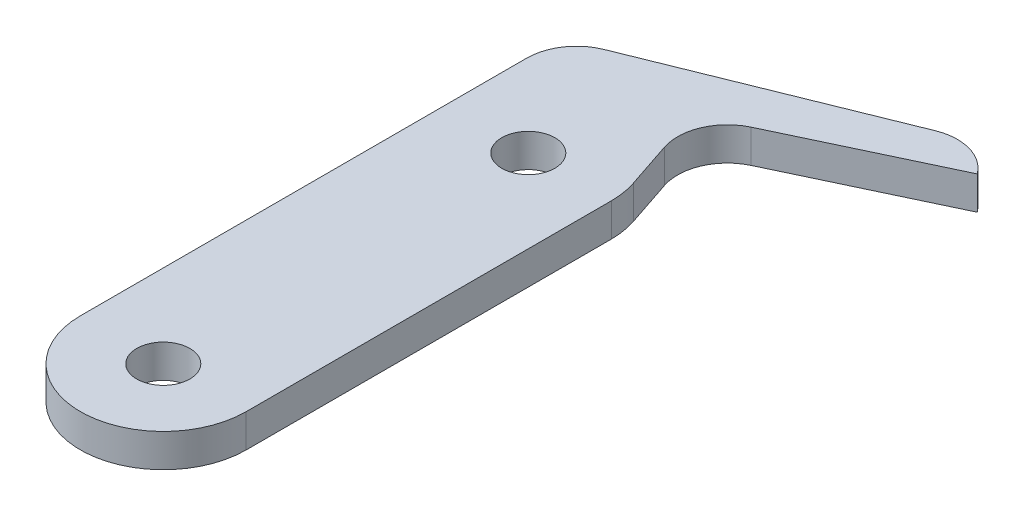
ISO-10303-21;
HEADER;
FILE_DESCRIPTION(('STEP AP214'),'2;1');
FILE_NAME('part.step','',(''),(''),'','','');
FILE_SCHEMA(('AUTOMOTIVE_DESIGN { 1 0 10303 214 1 1 1 1 }'));
ENDSEC;
DATA;
#1=APPLICATION_CONTEXT('core data for automotive mechanical design processes');
#2=APPLICATION_PROTOCOL_DEFINITION('international standard','automotive_design',2000,#1);
#3=PRODUCT_CONTEXT('',#1,'mechanical');
#4=PRODUCT('Part','Part','',(#3));
#5=PRODUCT_RELATED_PRODUCT_CATEGORY('part','',(#4));
#6=PRODUCT_DEFINITION_FORMATION('','',#4);
#7=PRODUCT_DEFINITION_CONTEXT('part definition',#1,'design');
#8=PRODUCT_DEFINITION('design','',#6,#7);
#9=PRODUCT_DEFINITION_SHAPE('','',#8);
#10=(LENGTH_UNIT() NAMED_UNIT(*) SI_UNIT(.MILLI.,.METRE.));
#11=(NAMED_UNIT(*) PLANE_ANGLE_UNIT() SI_UNIT($,.RADIAN.));
#12=(NAMED_UNIT(*) SI_UNIT($,.STERADIAN.) SOLID_ANGLE_UNIT());
#13=UNCERTAINTY_MEASURE_WITH_UNIT(LENGTH_MEASURE(1.E-05),#10,'distance_accuracy_value','');
#14=(GEOMETRIC_REPRESENTATION_CONTEXT(3) GLOBAL_UNCERTAINTY_ASSIGNED_CONTEXT((#13)) GLOBAL_UNIT_ASSIGNED_CONTEXT((#10,
#11,#12)) REPRESENTATION_CONTEXT('',''));
#15=CARTESIAN_POINT('',(0.,0.,0.));
#16=DIRECTION('',(0.,0.,1.));
#17=DIRECTION('',(1.,0.,0.));
#18=AXIS2_PLACEMENT_3D('',#15,#16,#17);
#19=CARTESIAN_POINT('',(0.,-1.,-11.));
#20=DIRECTION('',(0.,1.,0.));
#21=DIRECTION('',(0.,0.,1.));
#22=AXIS2_PLACEMENT_3D('',#19,#20,#21);
#23=CYLINDRICAL_SURFACE('',#22,5.);
#24=DIRECTION('',(0.,1.,0.));
#25=VECTOR('',#24,1.);
#26=CARTESIAN_POINT('',(4.74255581083825,-1.,-12.5837185296271));
#27=LINE('',#26,#25);
#28=CARTESIAN_POINT('',(4.74255581083825,-1.,-12.5837185296271));
#29=VERTEX_POINT('',#28);
#30=CARTESIAN_POINT('',(4.74255581083825,1.,-12.5837185296271));
#31=VERTEX_POINT('',#30);
#32=EDGE_CURVE('E135',#29,#31,#27,.T.);
#33=ORIENTED_EDGE('',*,*,#32,.T.);
#34=CARTESIAN_POINT('',(0.,1.,-11.));
#35=DIRECTION('',(0.,1.,0.));
#36=DIRECTION('',(0.,0.,1.));
#37=AXIS2_PLACEMENT_3D('',#34,#35,#36);
#38=CIRCLE('',#37,5.);
#39=CARTESIAN_POINT('',(5.,1.,-11.));
#40=VERTEX_POINT('',#39);
#41=EDGE_CURVE('E145',#40,#31,#38,.T.);
#42=ORIENTED_EDGE('',*,*,#41,.F.);
#43=DIRECTION('',(0.,1.,0.));
#44=VECTOR('',#43,1.);
#45=CARTESIAN_POINT('',(5.,-1.,-11.));
#46=LINE('',#45,#44);
#47=CARTESIAN_POINT('',(5.,-1.,-11.));
#48=VERTEX_POINT('',#47);
#49=EDGE_CURVE('E176',#48,#40,#46,.T.);
#50=ORIENTED_EDGE('',*,*,#49,.F.);
#51=CARTESIAN_POINT('',(0.,-1.,-11.));
#52=DIRECTION('',(0.,1.,0.));
#53=DIRECTION('',(0.,0.,1.));
#54=AXIS2_PLACEMENT_3D('',#51,#52,#53);
#55=CIRCLE('',#54,5.);
#56=EDGE_CURVE('E162',#48,#29,#55,.T.);
#57=ORIENTED_EDGE('',*,*,#56,.T.);
#58=EDGE_LOOP('',(#33,#42,#50,#57));
#59=FACE_BOUND('',#58,.T.);
#60=ADVANCED_FACE('F35',(#59),#23,.T.);
#61=CARTESIAN_POINT('',(5.,-1.,0.));
#62=DIRECTION('',(-1.,0.,0.));
#63=DIRECTION('',(0.,0.,1.));
#64=AXIS2_PLACEMENT_3D('',#61,#62,#63);
#65=PLANE('',#64);
#66=ORIENTED_EDGE('',*,*,#49,.T.);
#67=DIRECTION('',(0.,0.,1.));
#68=VECTOR('',#67,1.);
#69=CARTESIAN_POINT('',(5.,1.,0.));
#70=LINE('',#69,#68);
#71=CARTESIAN_POINT('',(5.,1.,11.));
#72=VERTEX_POINT('',#71);
#73=EDGE_CURVE('E153',#40,#72,#70,.T.);
#74=ORIENTED_EDGE('',*,*,#73,.T.);
#75=DIRECTION('',(0.,1.,0.));
#76=VECTOR('',#75,1.);
#77=CARTESIAN_POINT('',(5.,-1.,11.));
#78=LINE('',#77,#76);
#79=CARTESIAN_POINT('',(5.,-1.,11.));
#80=VERTEX_POINT('',#79);
#81=EDGE_CURVE('E179',#80,#72,#78,.T.);
#82=ORIENTED_EDGE('',*,*,#81,.F.);
#83=DIRECTION('',(0.,0.,1.));
#84=VECTOR('',#83,1.);
#85=CARTESIAN_POINT('',(5.,-1.,0.));
#86=LINE('',#85,#84);
#87=EDGE_CURVE('E170',#48,#80,#86,.T.);
#88=ORIENTED_EDGE('',*,*,#87,.F.);
#89=EDGE_LOOP('',(#66,#74,#82,#88));
#90=FACE_BOUND('',#89,.T.);
#91=ADVANCED_FACE('F220',(#90),#65,.F.);
#92=CARTESIAN_POINT('',(0.,-1.,11.));
#93=DIRECTION('',(0.,1.,0.));
#94=DIRECTION('',(0.,0.,1.));
#95=AXIS2_PLACEMENT_3D('',#92,#93,#94);
#96=CYLINDRICAL_SURFACE('',#95,5.);
#97=ORIENTED_EDGE('',*,*,#81,.T.);
#98=CARTESIAN_POINT('',(0.,1.,11.));
#99=DIRECTION('',(0.,1.,0.));
#100=DIRECTION('',(0.,0.,1.));
#101=AXIS2_PLACEMENT_3D('',#98,#99,#100);
#102=CIRCLE('',#101,5.);
#103=CARTESIAN_POINT('',(-5.,1.,11.));
#104=VERTEX_POINT('',#103);
#105=EDGE_CURVE('E150',#104,#72,#102,.T.);
#106=ORIENTED_EDGE('',*,*,#105,.F.);
#107=DIRECTION('',(0.,1.,0.));
#108=VECTOR('',#107,1.);
#109=CARTESIAN_POINT('',(-5.,-1.,11.));
#110=LINE('',#109,#108);
#111=CARTESIAN_POINT('',(-5.,-1.,11.));
#112=VERTEX_POINT('',#111);
#113=EDGE_CURVE('E175',#112,#104,#110,.T.);
#114=ORIENTED_EDGE('',*,*,#113,.F.);
#115=CARTESIAN_POINT('',(0.,-1.,11.));
#116=DIRECTION('',(0.,1.,0.));
#117=DIRECTION('',(0.,0.,1.));
#118=AXIS2_PLACEMENT_3D('',#115,#116,#117);
#119=CIRCLE('',#118,5.);
#120=EDGE_CURVE('E167',#112,#80,#119,.T.);
#121=ORIENTED_EDGE('',*,*,#120,.T.);
#122=EDGE_LOOP('',(#97,#106,#114,#121));
#123=FACE_BOUND('',#122,.T.);
#124=ADVANCED_FACE('F225',(#123),#96,.T.);
#125=CARTESIAN_POINT('',(-5.,-1.,0.));
#126=DIRECTION('',(-1.,0.,0.));
#127=DIRECTION('',(0.,0.,1.));
#128=AXIS2_PLACEMENT_3D('',#125,#126,#127);
#129=PLANE('',#128);
#130=DIRECTION('',(0.,0.,1.));
#131=VECTOR('',#130,1.);
#132=CARTESIAN_POINT('',(-5.,1.,0.));
#133=LINE('',#132,#131);
#134=CARTESIAN_POINT('',(-5.,1.,-15.9026436236529));
#135=VERTEX_POINT('',#134);
#136=EDGE_CURVE('E148',#135,#104,#133,.T.);
#137=ORIENTED_EDGE('',*,*,#136,.F.);
#138=DIRECTION('',(0.,1.,0.));
#139=VECTOR('',#138,1.);
#140=CARTESIAN_POINT('',(-5.,-1.,-15.9026436236529));
#141=LINE('',#140,#139);
#142=CARTESIAN_POINT('',(-5.,-1.,-15.9026436236529));
#143=VERTEX_POINT('',#142);
#144=EDGE_CURVE('E50',#135,#143,#141,.F.);
#145=ORIENTED_EDGE('',*,*,#144,.T.);
#146=DIRECTION('',(0.,0.,1.));
#147=VECTOR('',#146,1.);
#148=CARTESIAN_POINT('',(-5.,-1.,0.));
#149=LINE('',#148,#147);
#150=EDGE_CURVE('E165',#143,#112,#149,.T.);
#151=ORIENTED_EDGE('',*,*,#150,.T.);
#152=ORIENTED_EDGE('',*,*,#113,.T.);
#153=EDGE_LOOP('',(#137,#145,#151,#152));
#154=FACE_BOUND('',#153,.T.);
#155=ADVANCED_FACE('F226',(#154),#129,.T.);
#156=CARTESIAN_POINT('',(0.,-1.,11.));
#157=DIRECTION('',(0.,1.,0.));
#158=DIRECTION('',(0.,0.,1.));
#159=AXIS2_PLACEMENT_3D('',#156,#157,#158);
#160=CYLINDRICAL_SURFACE('',#159,1.6);
#161=CARTESIAN_POINT('',(0.,-1.,11.));
#162=DIRECTION('',(0.,1.,0.));
#163=DIRECTION('',(0.,0.,1.));
#164=AXIS2_PLACEMENT_3D('',#161,#162,#163);
#165=CIRCLE('',#164,1.6);
#166=CARTESIAN_POINT('',(0.,-1.,12.6));
#167=VERTEX_POINT('',#166);
#168=EDGE_CURVE('E159',#167,#167,#165,.T.);
#169=ORIENTED_EDGE('',*,*,#168,.F.);
#170=EDGE_LOOP('',(#169));
#171=FACE_BOUND('',#170,.T.);
#172=CARTESIAN_POINT('',(0.,1.,11.));
#173=DIRECTION('',(0.,1.,0.));
#174=DIRECTION('',(0.,0.,1.));
#175=AXIS2_PLACEMENT_3D('',#172,#173,#174);
#176=CIRCLE('',#175,1.6);
#177=CARTESIAN_POINT('',(0.,1.,12.6));
#178=VERTEX_POINT('',#177);
#179=EDGE_CURVE('E138',#178,#178,#176,.T.);
#180=ORIENTED_EDGE('',*,*,#179,.T.);
#181=EDGE_LOOP('',(#180));
#182=FACE_BOUND('',#181,.T.);
#183=ADVANCED_FACE('F249',(#171,#182),#160,.F.);
#184=CARTESIAN_POINT('',(0.,-1.,-11.));
#185=DIRECTION('',(0.,1.,0.));
#186=DIRECTION('',(0.,0.,1.));
#187=AXIS2_PLACEMENT_3D('',#184,#185,#186);
#188=CYLINDRICAL_SURFACE('',#187,1.6);
#189=CARTESIAN_POINT('',(0.,-1.,-11.));
#190=DIRECTION('',(0.,1.,0.));
#191=DIRECTION('',(0.,0.,1.));
#192=AXIS2_PLACEMENT_3D('',#189,#190,#191);
#193=CIRCLE('',#192,1.6);
#194=CARTESIAN_POINT('',(0.,-1.,-9.4));
#195=VERTEX_POINT('',#194);
#196=EDGE_CURVE('E172',#195,#195,#193,.T.);
#197=ORIENTED_EDGE('',*,*,#196,.F.);
#198=EDGE_LOOP('',(#197));
#199=FACE_BOUND('',#198,.T.);
#200=CARTESIAN_POINT('',(0.,1.,-11.));
#201=DIRECTION('',(0.,1.,0.));
#202=DIRECTION('',(0.,0.,1.));
#203=AXIS2_PLACEMENT_3D('',#200,#201,#202);
#204=CIRCLE('',#203,1.6);
#205=CARTESIAN_POINT('',(0.,1.,-9.4));
#206=VERTEX_POINT('',#205);
#207=EDGE_CURVE('E156',#206,#206,#204,.T.);
#208=ORIENTED_EDGE('',*,*,#207,.T.);
#209=EDGE_LOOP('',(#208));
#210=FACE_BOUND('',#209,.T.);
#211=ADVANCED_FACE('F252',(#199,#210),#188,.F.);
#212=CARTESIAN_POINT('',(0.,-1.,0.));
#213=DIRECTION('',(0.,1.,0.));
#214=DIRECTION('',(0.,0.,1.));
#215=AXIS2_PLACEMENT_3D('',#212,#213,#214);
#216=PLANE('',#215);
#217=ORIENTED_EDGE('',*,*,#168,.T.);
#218=EDGE_LOOP('',(#217));
#219=FACE_BOUND('',#218,.T.);
#220=DIRECTION('',(-0.927285205860935,0.,0.374355642392959));
#221=VECTOR('',#220,1.);
#222=CARTESIAN_POINT('',(-6.92370665185442,-1.,-17.1501375188203));
#223=LINE('',#222,#221);
#224=CARTESIAN_POINT('',(11.0954174100948,-1.,-24.424663976197));
#225=VERTEX_POINT('',#224);
#226=CARTESIAN_POINT('',(-3.12306692717887,-1.,-18.6844992412357));
#227=VERTEX_POINT('',#226);
#228=EDGE_CURVE('E118',#225,#227,#223,.T.);
#229=ORIENTED_EDGE('',*,*,#228,.F.);
#230=CARTESIAN_POINT('',(12.2184843372737,-1.,-21.6428083586142));
#231=DIRECTION('',(0.,1.,0.));
#232=DIRECTION('',(0.,0.,1.));
#233=AXIS2_PLACEMENT_3D('',#230,#231,#232);
#234=CIRCLE('',#233,3.);
#235=CARTESIAN_POINT('',(14.6235182164034,-1.,-23.4360768940652));
#236=VERTEX_POINT('',#235);
#237=EDGE_CURVE('E112',#225,#236,#234,.F.);
#238=ORIENTED_EDGE('',*,*,#237,.T.);
#239=DIRECTION('',(0.904226269217707,0.,-0.427053689899324));
#240=VECTOR('',#239,1.);
#241=CARTESIAN_POINT('',(-6.38295326200315,-1.,-13.5150079514656));
#242=LINE('',#241,#240);
#243=CARTESIAN_POINT('',(5.36612288642129,-1.,-19.0639357949729));
#244=VERTEX_POINT('',#243);
#245=EDGE_CURVE('E116',#244,#236,#242,.T.);
#246=ORIENTED_EDGE('',*,*,#245,.F.);
#247=CARTESIAN_POINT('',(6.64728395611924,-1.,-16.3512569873197));
#248=DIRECTION('',(0.,1.,0.));
#249=DIRECTION('',(0.,0.,1.));
#250=AXIS2_PLACEMENT_3D('',#247,#248,#249);
#251=CIRCLE('',#250,3.);
#252=CARTESIAN_POINT('',(3.80175046961622,-1.,-15.4010258695437));
#253=VERTEX_POINT('',#252);
#254=EDGE_CURVE('E11',#244,#253,#251,.T.);
#255=ORIENTED_EDGE('',*,*,#254,.T.);
#256=DIRECTION('',(0.316743705925427,0.,0.948511162167659));
#257=VECTOR('',#256,1.);
#258=CARTESIAN_POINT('',(8.04734015762102,-1.,-2.68731085730423));
#259=LINE('',#258,#257);
#260=EDGE_CURVE('E130',#253,#29,#259,.T.);
#261=ORIENTED_EDGE('',*,*,#260,.T.);
#262=ORIENTED_EDGE('',*,*,#56,.F.);
#263=ORIENTED_EDGE('',*,*,#87,.T.);
#264=ORIENTED_EDGE('',*,*,#120,.F.);
#265=ORIENTED_EDGE('',*,*,#150,.F.);
#266=CARTESIAN_POINT('',(-2.,-1.,-15.9026436236529));
#267=DIRECTION('',(0.,1.,0.));
#268=DIRECTION('',(0.,0.,1.));
#269=AXIS2_PLACEMENT_3D('',#266,#267,#268);
#270=CIRCLE('',#269,3.);
#271=EDGE_CURVE('E57',#143,#227,#270,.F.);
#272=ORIENTED_EDGE('',*,*,#271,.T.);
#273=EDGE_LOOP('',(#229,#238,#246,#255,#261,#262,#263,#264,#265,#272));
#274=FACE_BOUND('',#273,.T.);
#275=ORIENTED_EDGE('',*,*,#196,.T.);
#276=EDGE_LOOP('',(#275));
#277=FACE_BOUND('',#276,.T.);
#278=ADVANCED_FACE('F114',(#219,#274,#277),#216,.F.);
#279=CARTESIAN_POINT('',(0.,1.,0.));
#280=DIRECTION('',(0.,1.,0.));
#281=DIRECTION('',(0.,0.,1.));
#282=AXIS2_PLACEMENT_3D('',#279,#280,#281);
#283=PLANE('',#282);
#284=ORIENTED_EDGE('',*,*,#179,.F.);
#285=EDGE_LOOP('',(#284));
#286=FACE_BOUND('',#285,.T.);
#287=DIRECTION('',(0.904226269217707,0.,-0.427053689899324));
#288=VECTOR('',#287,1.);
#289=CARTESIAN_POINT('',(-6.38295326200315,1.,-13.5150079514656));
#290=LINE('',#289,#288);
#291=CARTESIAN_POINT('',(5.36612288642129,1.,-19.0639357949729));
#292=VERTEX_POINT('',#291);
#293=CARTESIAN_POINT('',(14.6235182164034,1.,-23.4360768940652));
#294=VERTEX_POINT('',#293);
#295=EDGE_CURVE('E199',#292,#294,#290,.T.);
#296=ORIENTED_EDGE('',*,*,#295,.T.);
#297=CARTESIAN_POINT('',(12.2184843372737,1.,-21.6428083586142));
#298=DIRECTION('',(0.,1.,0.));
#299=DIRECTION('',(0.,0.,1.));
#300=AXIS2_PLACEMENT_3D('',#297,#298,#299);
#301=CIRCLE('',#300,3.);
#302=CARTESIAN_POINT('',(11.0954174100949,1.,-24.4246639761971));
#303=VERTEX_POINT('',#302);
#304=EDGE_CURVE('E133',#294,#303,#301,.T.);
#305=ORIENTED_EDGE('',*,*,#304,.T.);
#306=DIRECTION('',(-0.927285205860935,0.,0.374355642392959));
#307=VECTOR('',#306,1.);
#308=CARTESIAN_POINT('',(-6.92370665185442,1.,-17.1501375188203));
#309=LINE('',#308,#307);
#310=CARTESIAN_POINT('',(-3.12306692717887,1.,-18.6844992412357));
#311=VERTEX_POINT('',#310);
#312=EDGE_CURVE('E203',#303,#311,#309,.T.);
#313=ORIENTED_EDGE('',*,*,#312,.T.);
#314=CARTESIAN_POINT('',(-2.,1.,-15.9026436236529));
#315=DIRECTION('',(0.,1.,0.));
#316=DIRECTION('',(0.,0.,1.));
#317=AXIS2_PLACEMENT_3D('',#314,#315,#316);
#318=CIRCLE('',#317,3.);
#319=EDGE_CURVE('E186',#311,#135,#318,.T.);
#320=ORIENTED_EDGE('',*,*,#319,.T.);
#321=ORIENTED_EDGE('',*,*,#136,.T.);
#322=ORIENTED_EDGE('',*,*,#105,.T.);
#323=ORIENTED_EDGE('',*,*,#73,.F.);
#324=ORIENTED_EDGE('',*,*,#41,.T.);
#325=DIRECTION('',(0.316743705925427,0.,0.948511162167659));
#326=VECTOR('',#325,1.);
#327=CARTESIAN_POINT('',(8.04734015762102,1.,-2.68731085730423));
#328=LINE('',#327,#326);
#329=CARTESIAN_POINT('',(3.80175046961622,1.,-15.4010258695437));
#330=VERTEX_POINT('',#329);
#331=EDGE_CURVE('E200',#330,#31,#328,.T.);
#332=ORIENTED_EDGE('',*,*,#331,.F.);
#333=CARTESIAN_POINT('',(6.64728395611924,1.,-16.3512569873197));
#334=DIRECTION('',(0.,1.,0.));
#335=DIRECTION('',(0.,0.,1.));
#336=AXIS2_PLACEMENT_3D('',#333,#334,#335);
#337=CIRCLE('',#336,3.);
#338=EDGE_CURVE('E43',#330,#292,#337,.F.);
#339=ORIENTED_EDGE('',*,*,#338,.T.);
#340=EDGE_LOOP('',(#296,#305,#313,#320,#321,#322,#323,#324,#332,#339));
#341=FACE_BOUND('',#340,.T.);
#342=ORIENTED_EDGE('',*,*,#207,.F.);
#343=EDGE_LOOP('',(#342));
#344=FACE_BOUND('',#343,.T.);
#345=ADVANCED_FACE('F197',(#286,#341,#344),#283,.T.);
#346=CARTESIAN_POINT('',(8.04734015762102,-1.,-2.68731085730423));
#347=DIRECTION('',(-0.948511162167651,0.,0.316743705925425));
#348=DIRECTION('',(0.316743705925425,0.,0.948511162167651));
#349=AXIS2_PLACEMENT_3D('',#346,#347,#348);
#350=PLANE('',#349);
#351=ORIENTED_EDGE('',*,*,#260,.F.);
#352=DIRECTION('',(0.,1.,0.));
#353=VECTOR('',#352,1.);
#354=CARTESIAN_POINT('',(3.80175046961629,-1.,-15.4010258695435));
#355=LINE('',#354,#353);
#356=EDGE_CURVE('E178',#253,#330,#355,.T.);
#357=ORIENTED_EDGE('',*,*,#356,.T.);
#358=ORIENTED_EDGE('',*,*,#331,.T.);
#359=ORIENTED_EDGE('',*,*,#32,.F.);
#360=EDGE_LOOP('',(#351,#357,#358,#359));
#361=FACE_BOUND('',#360,.T.);
#362=ADVANCED_FACE('F210',(#361),#350,.F.);
#363=CARTESIAN_POINT('',(-6.92370665185442,-1.,-17.1501375188203));
#364=DIRECTION('',(-0.374355642392959,0.,-0.927285205860934));
#365=DIRECTION('',(-0.927285205860934,0.,0.374355642392959));
#366=AXIS2_PLACEMENT_3D('',#363,#364,#365);
#367=PLANE('',#366);
#368=ORIENTED_EDGE('',*,*,#312,.F.);
#369=DIRECTION('',(0.,1.,0.));
#370=VECTOR('',#369,1.);
#371=CARTESIAN_POINT('',(11.0954174100948,-1.,-24.424663976197));
#372=LINE('',#371,#370);
#373=EDGE_CURVE('E192',#303,#225,#372,.F.);
#374=ORIENTED_EDGE('',*,*,#373,.T.);
#375=ORIENTED_EDGE('',*,*,#228,.T.);
#376=DIRECTION('',(0.,1.,0.));
#377=VECTOR('',#376,1.);
#378=CARTESIAN_POINT('',(-3.12306692717888,-1.,-18.6844992412357));
#379=LINE('',#378,#377);
#380=EDGE_CURVE('E189',#227,#311,#379,.T.);
#381=ORIENTED_EDGE('',*,*,#380,.T.);
#382=EDGE_LOOP('',(#368,#374,#375,#381));
#383=FACE_BOUND('',#382,.T.);
#384=ADVANCED_FACE('F231',(#383),#367,.T.);
#385=CARTESIAN_POINT('',(-6.38295326200315,-1.,-13.5150079514656));
#386=DIRECTION('',(0.427053689899324,0.,0.904226269217706));
#387=DIRECTION('',(0.904226269217707,0.,-0.427053689899324));
#388=AXIS2_PLACEMENT_3D('',#385,#386,#387);
#389=PLANE('',#388);
#390=ORIENTED_EDGE('',*,*,#295,.F.);
#391=DIRECTION('',(0.,1.,0.));
#392=VECTOR('',#391,1.);
#393=CARTESIAN_POINT('',(5.36612288642127,-1.,-19.0639357949729));
#394=LINE('',#393,#392);
#395=EDGE_CURVE('E129',#292,#244,#394,.F.);
#396=ORIENTED_EDGE('',*,*,#395,.T.);
#397=ORIENTED_EDGE('',*,*,#245,.T.);
#398=DIRECTION('',(0.,1.,0.));
#399=VECTOR('',#398,1.);
#400=CARTESIAN_POINT('',(14.6235182164034,-1.,-23.4360768940652));
#401=LINE('',#400,#399);
#402=EDGE_CURVE('E127',#236,#294,#401,.T.);
#403=ORIENTED_EDGE('',*,*,#402,.T.);
#404=EDGE_LOOP('',(#390,#396,#397,#403));
#405=FACE_BOUND('',#404,.T.);
#406=ADVANCED_FACE('F126',(#405),#389,.T.);
#407=CARTESIAN_POINT('',(6.64728395611924,-1.,-16.3512569873197));
#408=DIRECTION('',(0.,1.,0.));
#409=DIRECTION('',(0.,0.,1.));
#410=AXIS2_PLACEMENT_3D('',#407,#408,#409);
#411=CYLINDRICAL_SURFACE('',#410,3.);
#412=ORIENTED_EDGE('',*,*,#254,.F.);
#413=ORIENTED_EDGE('',*,*,#395,.F.);
#414=ORIENTED_EDGE('',*,*,#338,.F.);
#415=ORIENTED_EDGE('',*,*,#356,.F.);
#416=EDGE_LOOP('',(#412,#413,#414,#415));
#417=FACE_BOUND('',#416,.T.);
#418=ADVANCED_FACE('F205',(#417),#411,.F.);
#419=CARTESIAN_POINT('',(12.2184843372737,-1.,-21.6428083586142));
#420=DIRECTION('',(0.,-1.,0.));
#421=DIRECTION('',(0.,0.,-1.));
#422=AXIS2_PLACEMENT_3D('',#419,#420,#421);
#423=CYLINDRICAL_SURFACE('',#422,3.);
#424=ORIENTED_EDGE('',*,*,#237,.F.);
#425=ORIENTED_EDGE('',*,*,#373,.F.);
#426=ORIENTED_EDGE('',*,*,#304,.F.);
#427=ORIENTED_EDGE('',*,*,#402,.F.);
#428=EDGE_LOOP('',(#424,#425,#426,#427));
#429=FACE_BOUND('',#428,.T.);
#430=ADVANCED_FACE('F132',(#429),#423,.T.);
#431=CARTESIAN_POINT('',(-2.,-1.,-15.9026436236529));
#432=DIRECTION('',(0.,1.,0.));
#433=DIRECTION('',(0.,0.,1.));
#434=AXIS2_PLACEMENT_3D('',#431,#432,#433);
#435=CYLINDRICAL_SURFACE('',#434,3.);
#436=ORIENTED_EDGE('',*,*,#271,.F.);
#437=ORIENTED_EDGE('',*,*,#144,.F.);
#438=ORIENTED_EDGE('',*,*,#319,.F.);
#439=ORIENTED_EDGE('',*,*,#380,.F.);
#440=EDGE_LOOP('',(#436,#437,#438,#439));
#441=FACE_BOUND('',#440,.T.);
#442=ADVANCED_FACE('F37',(#441),#435,.T.);
#443=CLOSED_SHELL('',(#60,#91,#124,#155,#183,#211,#278,#345,#362,#384,#406,#418,#430,#442));
#444=MANIFOLD_SOLID_BREP('B2',#443);
#445=ADVANCED_BREP_SHAPE_REPRESENTATION('',(#18,#444),#14);
#446=SHAPE_DEFINITION_REPRESENTATION(#9,#445);
ENDSEC;
END-ISO-10303-21;
